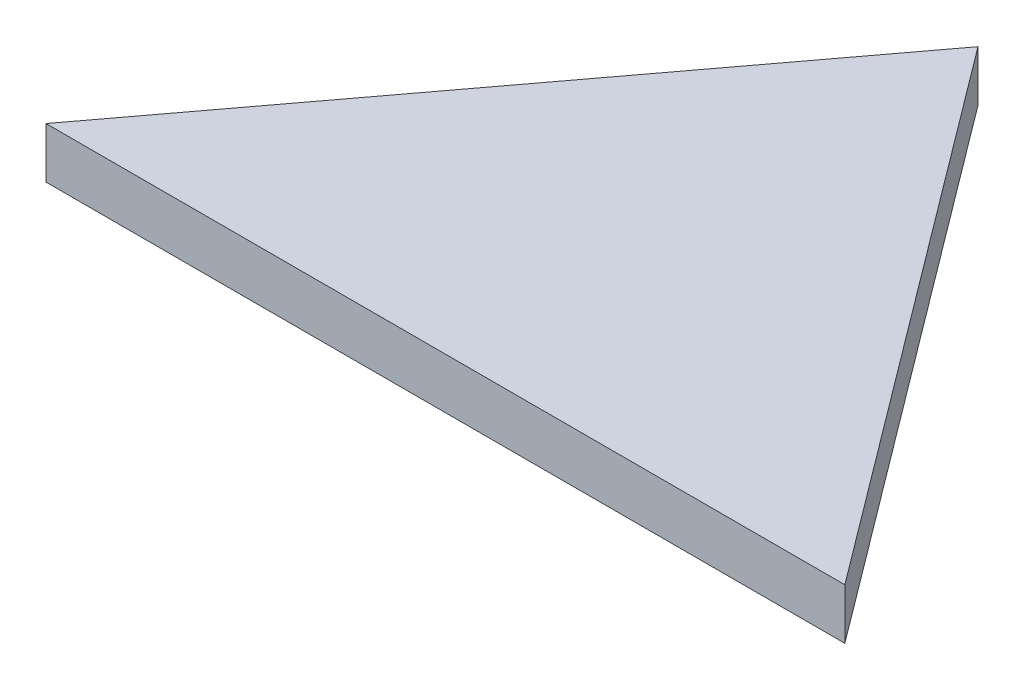
ISO-10303-21;
HEADER;
FILE_DESCRIPTION(('STEP AP214'),'2;1');
FILE_NAME('part.step','',(''),(''),'','','');
FILE_SCHEMA(('AUTOMOTIVE_DESIGN { 1 0 10303 214 1 1 1 1 }'));
ENDSEC;
DATA;
#1=APPLICATION_CONTEXT('core data for automotive mechanical design processes');
#2=APPLICATION_PROTOCOL_DEFINITION('international standard','automotive_design',2000,#1);
#3=PRODUCT_CONTEXT('',#1,'mechanical');
#4=PRODUCT('Part','Part','',(#3));
#5=PRODUCT_RELATED_PRODUCT_CATEGORY('part','',(#4));
#6=PRODUCT_DEFINITION_FORMATION('','',#4);
#7=PRODUCT_DEFINITION_CONTEXT('part definition',#1,'design');
#8=PRODUCT_DEFINITION('design','',#6,#7);
#9=PRODUCT_DEFINITION_SHAPE('','',#8);
#10=(LENGTH_UNIT() NAMED_UNIT(*) SI_UNIT(.MILLI.,.METRE.));
#11=(NAMED_UNIT(*) PLANE_ANGLE_UNIT() SI_UNIT($,.RADIAN.));
#12=(NAMED_UNIT(*) SI_UNIT($,.STERADIAN.) SOLID_ANGLE_UNIT());
#13=UNCERTAINTY_MEASURE_WITH_UNIT(LENGTH_MEASURE(1.E-05),#10,'distance_accuracy_value','');
#14=(GEOMETRIC_REPRESENTATION_CONTEXT(3) GLOBAL_UNCERTAINTY_ASSIGNED_CONTEXT((#13)) GLOBAL_UNIT_ASSIGNED_CONTEXT((#10,
#11,#12)) REPRESENTATION_CONTEXT('',''));
#15=CARTESIAN_POINT('',(0.,0.,0.));
#16=DIRECTION('',(0.,0.,1.));
#17=DIRECTION('',(1.,0.,0.));
#18=AXIS2_PLACEMENT_3D('',#15,#16,#17);
#19=CARTESIAN_POINT('',(0.,189.802563773199,-100.));
#20=DIRECTION('',(0.8,0.,0.6));
#21=DIRECTION('',(0.6,0.,-0.8));
#22=AXIS2_PLACEMENT_3D('',#19,#20,#21);
#23=PLANE('',#22);
#24=DIRECTION('',(-0.6,0.,0.8));
#25=VECTOR('',#24,1.);
#26=CARTESIAN_POINT('',(0.,9.52500000000001,-100.));
#27=LINE('',#26,#25);
#28=CARTESIAN_POINT('',(0.,9.52500000000001,-100.));
#29=VERTEX_POINT('',#28);
#30=CARTESIAN_POINT('',(-75.,9.52500000000001,0.));
#31=VERTEX_POINT('',#30);
#32=EDGE_CURVE('E42',#29,#31,#27,.T.);
#33=ORIENTED_EDGE('',*,*,#32,.F.);
#34=DIRECTION('',(0.,-1.,0.));
#35=VECTOR('',#34,1.);
#36=CARTESIAN_POINT('',(0.,189.802563773199,-100.));
#37=LINE('',#36,#35);
#38=CARTESIAN_POINT('',(0.,0.,-100.));
#39=VERTEX_POINT('',#38);
#40=EDGE_CURVE('E37',#29,#39,#37,.T.);
#41=ORIENTED_EDGE('',*,*,#40,.T.);
#42=DIRECTION('',(-0.6,0.,0.8));
#43=VECTOR('',#42,1.);
#44=CARTESIAN_POINT('',(0.,0.,-100.));
#45=LINE('',#44,#43);
#46=CARTESIAN_POINT('',(-75.,0.,0.));
#47=VERTEX_POINT('',#46);
#48=EDGE_CURVE('E72',#39,#47,#45,.T.);
#49=ORIENTED_EDGE('',*,*,#48,.T.);
#50=DIRECTION('',(0.,-1.,0.));
#51=VECTOR('',#50,1.);
#52=CARTESIAN_POINT('',(-75.,189.802563773199,0.));
#53=LINE('',#52,#51);
#54=EDGE_CURVE('E67',#31,#47,#53,.T.);
#55=ORIENTED_EDGE('',*,*,#54,.F.);
#56=EDGE_LOOP('',(#33,#41,#49,#55));
#57=FACE_BOUND('',#56,.T.);
#58=ADVANCED_FACE('F33',(#57),#23,.F.);
#59=CARTESIAN_POINT('',(-75.,189.802563773199,0.));
#60=DIRECTION('',(0.,0.,-1.));
#61=DIRECTION('',(-1.,0.,0.));
#62=AXIS2_PLACEMENT_3D('',#59,#60,#61);
#63=PLANE('',#62);
#64=DIRECTION('',(1.,0.,0.));
#65=VECTOR('',#64,1.);
#66=CARTESIAN_POINT('',(-75.,9.52500000000001,0.));
#67=LINE('',#66,#65);
#68=CARTESIAN_POINT('',(75.,9.52500000000001,0.));
#69=VERTEX_POINT('',#68);
#70=EDGE_CURVE('E11',#31,#69,#67,.T.);
#71=ORIENTED_EDGE('',*,*,#70,.F.);
#72=ORIENTED_EDGE('',*,*,#54,.T.);
#73=DIRECTION('',(1.,0.,0.));
#74=VECTOR('',#73,1.);
#75=CARTESIAN_POINT('',(-75.,0.,0.));
#76=LINE('',#75,#74);
#77=CARTESIAN_POINT('',(75.,0.,0.));
#78=VERTEX_POINT('',#77);
#79=EDGE_CURVE('E82',#47,#78,#76,.T.);
#80=ORIENTED_EDGE('',*,*,#79,.T.);
#81=DIRECTION('',(0.,-1.,0.));
#82=VECTOR('',#81,1.);
#83=CARTESIAN_POINT('',(75.,189.802563773199,0.));
#84=LINE('',#83,#82);
#85=EDGE_CURVE('E55',#69,#78,#84,.T.);
#86=ORIENTED_EDGE('',*,*,#85,.F.);
#87=EDGE_LOOP('',(#71,#72,#80,#86));
#88=FACE_BOUND('',#87,.T.);
#89=ADVANCED_FACE('F88',(#88),#63,.F.);
#90=CARTESIAN_POINT('',(75.,189.802563773199,0.));
#91=DIRECTION('',(-0.8,0.,0.6));
#92=DIRECTION('',(0.6,0.,0.8));
#93=AXIS2_PLACEMENT_3D('',#90,#91,#92);
#94=PLANE('',#93);
#95=DIRECTION('',(-0.6,0.,-0.8));
#96=VECTOR('',#95,1.);
#97=CARTESIAN_POINT('',(75.,9.52500000000001,0.));
#98=LINE('',#97,#96);
#99=EDGE_CURVE('E79',#69,#29,#98,.T.);
#100=ORIENTED_EDGE('',*,*,#99,.F.);
#101=ORIENTED_EDGE('',*,*,#85,.T.);
#102=DIRECTION('',(-0.6,0.,-0.8));
#103=VECTOR('',#102,1.);
#104=CARTESIAN_POINT('',(75.,0.,0.));
#105=LINE('',#104,#103);
#106=EDGE_CURVE('E76',#78,#39,#105,.T.);
#107=ORIENTED_EDGE('',*,*,#106,.T.);
#108=ORIENTED_EDGE('',*,*,#40,.F.);
#109=EDGE_LOOP('',(#100,#101,#107,#108));
#110=FACE_BOUND('',#109,.T.);
#111=ADVANCED_FACE('F77',(#110),#94,.F.);
#112=CARTESIAN_POINT('',(0.,0.,0.));
#113=DIRECTION('',(0.,-1.,0.));
#114=DIRECTION('',(0.,0.,-1.));
#115=AXIS2_PLACEMENT_3D('',#112,#113,#114);
#116=PLANE('',#115);
#117=ORIENTED_EDGE('',*,*,#48,.F.);
#118=ORIENTED_EDGE('',*,*,#106,.F.);
#119=ORIENTED_EDGE('',*,*,#79,.F.);
#120=EDGE_LOOP('',(#117,#118,#119));
#121=FACE_BOUND('',#120,.T.);
#122=ADVANCED_FACE('F81',(#121),#116,.T.);
#123=CARTESIAN_POINT('',(0.,9.525,0.));
#124=DIRECTION('',(0.,1.,0.));
#125=DIRECTION('',(0.,0.,1.));
#126=AXIS2_PLACEMENT_3D('',#123,#124,#125);
#127=PLANE('',#126);
#128=ORIENTED_EDGE('',*,*,#99,.T.);
#129=ORIENTED_EDGE('',*,*,#32,.T.);
#130=ORIENTED_EDGE('',*,*,#70,.T.);
#131=EDGE_LOOP('',(#128,#129,#130));
#132=FACE_BOUND('',#131,.T.);
#133=ADVANCED_FACE('F35',(#132),#127,.T.);
#134=CLOSED_SHELL('',(#58,#89,#111,#122,#133));
#135=MANIFOLD_SOLID_BREP('B2',#134);
#136=ADVANCED_BREP_SHAPE_REPRESENTATION('',(#18,#135),#14);
#137=SHAPE_DEFINITION_REPRESENTATION(#9,#136);
ENDSEC;
END-ISO-10303-21;
